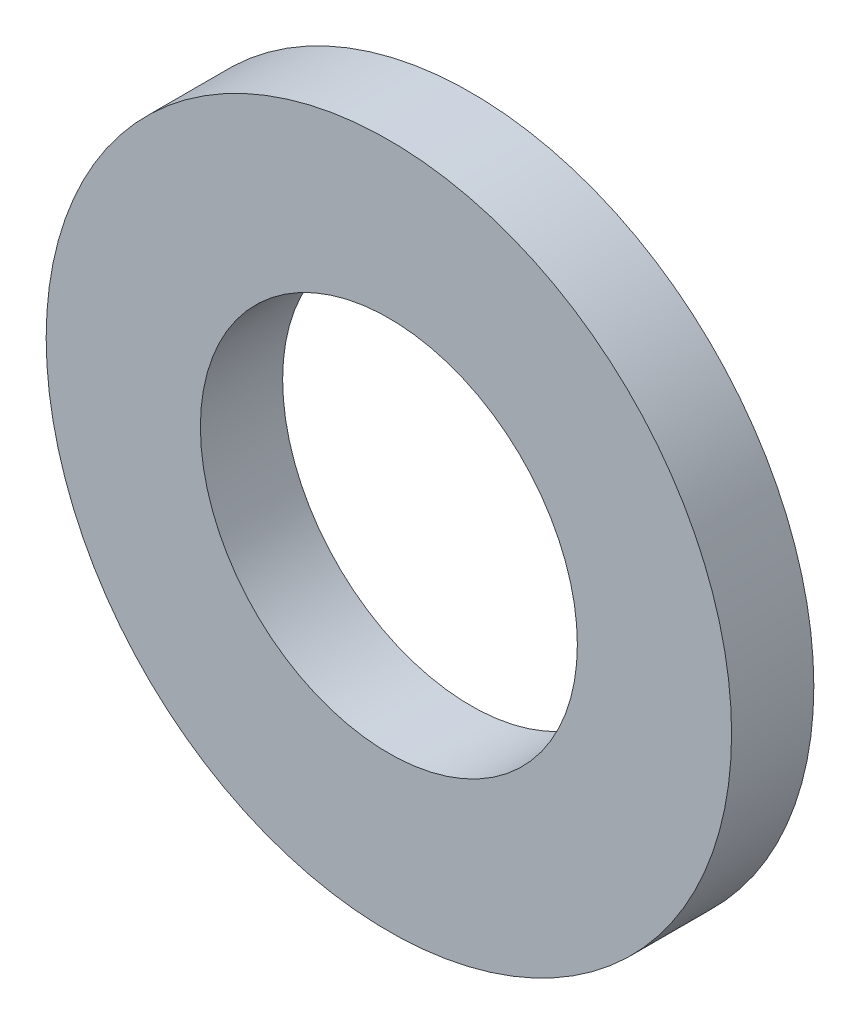
ISO-10303-21;
HEADER;
FILE_DESCRIPTION(('STEP AP214'),'2;1');
FILE_NAME('part.step','',(''),(''),'','','');
FILE_SCHEMA(('AUTOMOTIVE_DESIGN { 1 0 10303 214 1 1 1 1 }'));
ENDSEC;
DATA;
#1=APPLICATION_CONTEXT('core data for automotive mechanical design processes');
#2=APPLICATION_PROTOCOL_DEFINITION('international standard','automotive_design',2000,#1);
#3=PRODUCT_CONTEXT('',#1,'mechanical');
#4=PRODUCT('Part','Part','',(#3));
#5=PRODUCT_RELATED_PRODUCT_CATEGORY('part','',(#4));
#6=PRODUCT_DEFINITION_FORMATION('','',#4);
#7=PRODUCT_DEFINITION_CONTEXT('part definition',#1,'design');
#8=PRODUCT_DEFINITION('design','',#6,#7);
#9=PRODUCT_DEFINITION_SHAPE('','',#8);
#10=(LENGTH_UNIT() NAMED_UNIT(*) SI_UNIT(.MILLI.,.METRE.));
#11=(NAMED_UNIT(*) PLANE_ANGLE_UNIT() SI_UNIT($,.RADIAN.));
#12=(NAMED_UNIT(*) SI_UNIT($,.STERADIAN.) SOLID_ANGLE_UNIT());
#13=UNCERTAINTY_MEASURE_WITH_UNIT(LENGTH_MEASURE(1.E-05),#10,'distance_accuracy_value','');
#14=(GEOMETRIC_REPRESENTATION_CONTEXT(3) GLOBAL_UNCERTAINTY_ASSIGNED_CONTEXT((#13)) GLOBAL_UNIT_ASSIGNED_CONTEXT((#10,
#11,#12)) REPRESENTATION_CONTEXT('',''));
#15=CARTESIAN_POINT('',(0.,0.,0.));
#16=DIRECTION('',(0.,0.,1.));
#17=DIRECTION('',(1.,0.,0.));
#18=AXIS2_PLACEMENT_3D('',#15,#16,#17);
#19=CARTESIAN_POINT('',(0.,0.,1.19999999999998));
#20=DIRECTION('',(0.,0.,1.));
#21=DIRECTION('',(1.,0.,0.));
#22=AXIS2_PLACEMENT_3D('',#19,#20,#21);
#23=PLANE('',#22);
#24=CARTESIAN_POINT('',(0.,0.,1.19999999999998));
#25=DIRECTION('',(0.,0.,1.));
#26=DIRECTION('',(1.,0.,0.));
#27=AXIS2_PLACEMENT_3D('',#24,#25,#26);
#28=CIRCLE('',#27,5.);
#29=CARTESIAN_POINT('',(5.,0.,1.19999999999998));
#30=VERTEX_POINT('',#29);
#31=EDGE_CURVE('E10',#30,#30,#28,.T.);
#32=ORIENTED_EDGE('',*,*,#31,.T.);
#33=EDGE_LOOP('',(#32));
#34=FACE_BOUND('',#33,.T.);
#35=CARTESIAN_POINT('',(0.,0.,1.19999999999998));
#36=DIRECTION('',(0.,0.,1.));
#37=DIRECTION('',(1.,0.,0.));
#38=AXIS2_PLACEMENT_3D('',#35,#36,#37);
#39=CIRCLE('',#38,2.75);
#40=CARTESIAN_POINT('',(2.75,0.,1.19999999999998));
#41=VERTEX_POINT('',#40);
#42=EDGE_CURVE('E48',#41,#41,#39,.T.);
#43=ORIENTED_EDGE('',*,*,#42,.F.);
#44=EDGE_LOOP('',(#43));
#45=FACE_BOUND('',#44,.T.);
#46=ADVANCED_FACE('F37',(#34,#45),#23,.T.);
#47=CARTESIAN_POINT('',(0.,0.,0.));
#48=DIRECTION('',(0.,0.,1.));
#49=DIRECTION('',(1.,0.,0.));
#50=AXIS2_PLACEMENT_3D('',#47,#48,#49);
#51=PLANE('',#50);
#52=CARTESIAN_POINT('',(0.,0.,0.));
#53=DIRECTION('',(0.,0.,1.));
#54=DIRECTION('',(1.,0.,0.));
#55=AXIS2_PLACEMENT_3D('',#52,#53,#54);
#56=CIRCLE('',#55,5.);
#57=CARTESIAN_POINT('',(5.,0.,0.));
#58=VERTEX_POINT('',#57);
#59=EDGE_CURVE('E41',#58,#58,#56,.T.);
#60=ORIENTED_EDGE('',*,*,#59,.F.);
#61=EDGE_LOOP('',(#60));
#62=FACE_BOUND('',#61,.T.);
#63=CARTESIAN_POINT('',(0.,0.,0.));
#64=DIRECTION('',(0.,0.,1.));
#65=DIRECTION('',(1.,0.,0.));
#66=AXIS2_PLACEMENT_3D('',#63,#64,#65);
#67=CIRCLE('',#66,2.75);
#68=CARTESIAN_POINT('',(2.75,0.,0.));
#69=VERTEX_POINT('',#68);
#70=EDGE_CURVE('E50',#69,#69,#67,.T.);
#71=ORIENTED_EDGE('',*,*,#70,.T.);
#72=EDGE_LOOP('',(#71));
#73=FACE_BOUND('',#72,.T.);
#74=ADVANCED_FACE('F60',(#62,#73),#51,.F.);
#75=CARTESIAN_POINT('',(0.,0.,1.19999999999998));
#76=DIRECTION('',(0.,0.,-1.));
#77=DIRECTION('',(-1.,0.,0.));
#78=AXIS2_PLACEMENT_3D('',#75,#76,#77);
#79=CYLINDRICAL_SURFACE('',#78,5.);
#80=ORIENTED_EDGE('',*,*,#31,.F.);
#81=EDGE_LOOP('',(#80));
#82=FACE_BOUND('',#81,.T.);
#83=ORIENTED_EDGE('',*,*,#59,.T.);
#84=EDGE_LOOP('',(#83));
#85=FACE_BOUND('',#84,.T.);
#86=ADVANCED_FACE('F39',(#82,#85),#79,.T.);
#87=CARTESIAN_POINT('',(0.,0.,1.19999999999998));
#88=DIRECTION('',(0.,0.,-1.));
#89=DIRECTION('',(-1.,0.,0.));
#90=AXIS2_PLACEMENT_3D('',#87,#88,#89);
#91=CYLINDRICAL_SURFACE('',#90,2.75);
#92=ORIENTED_EDGE('',*,*,#42,.T.);
#93=EDGE_LOOP('',(#92));
#94=FACE_BOUND('',#93,.T.);
#95=ORIENTED_EDGE('',*,*,#70,.F.);
#96=EDGE_LOOP('',(#95));
#97=FACE_BOUND('',#96,.T.);
#98=ADVANCED_FACE('F56',(#94,#97),#91,.F.);
#99=CLOSED_SHELL('',(#46,#74,#86,#98));
#100=MANIFOLD_SOLID_BREP('B2',#99);
#101=ADVANCED_BREP_SHAPE_REPRESENTATION('',(#18,#100),#14);
#102=SHAPE_DEFINITION_REPRESENTATION(#9,#101);
ENDSEC;
END-ISO-10303-21;
